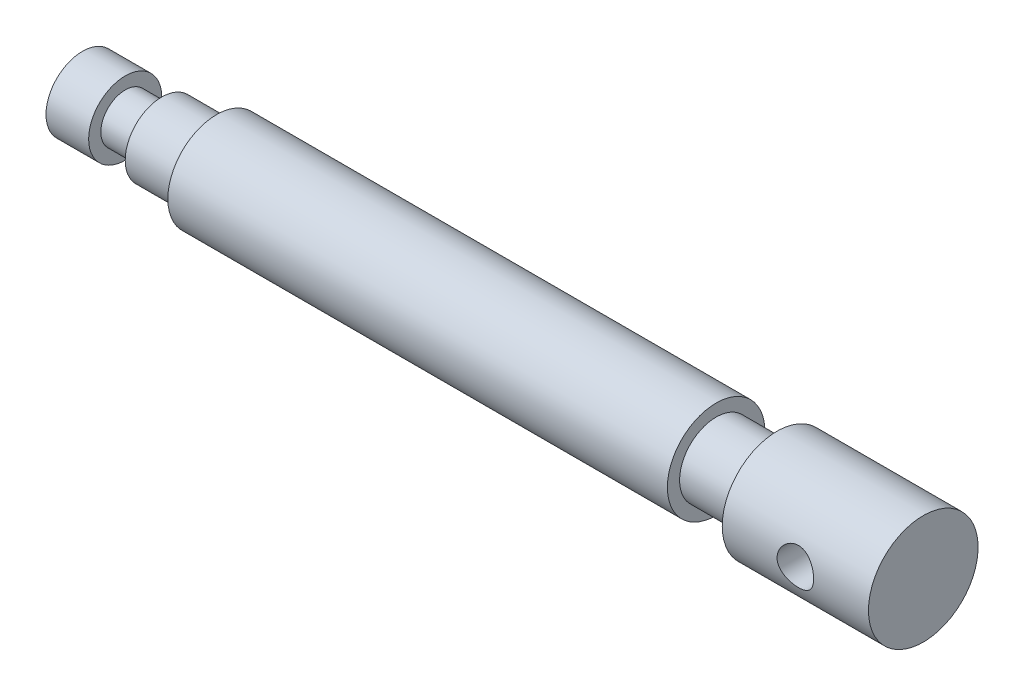
ISO-10303-21;
HEADER;
FILE_DESCRIPTION(('STEP AP214'),'2;1');
FILE_NAME('part.step','',(''),(''),'','','');
FILE_SCHEMA(('AUTOMOTIVE_DESIGN { 1 0 10303 214 1 1 1 1 }'));
ENDSEC;
DATA;
#1=APPLICATION_CONTEXT('core data for automotive mechanical design processes');
#2=APPLICATION_PROTOCOL_DEFINITION('international standard','automotive_design',2000,#1);
#3=PRODUCT_CONTEXT('',#1,'mechanical');
#4=PRODUCT('Part','Part','',(#3));
#5=PRODUCT_RELATED_PRODUCT_CATEGORY('part','',(#4));
#6=PRODUCT_DEFINITION_FORMATION('','',#4);
#7=PRODUCT_DEFINITION_CONTEXT('part definition',#1,'design');
#8=PRODUCT_DEFINITION('design','',#6,#7);
#9=PRODUCT_DEFINITION_SHAPE('','',#8);
#10=(LENGTH_UNIT() NAMED_UNIT(*) SI_UNIT(.MILLI.,.METRE.));
#11=(NAMED_UNIT(*) PLANE_ANGLE_UNIT() SI_UNIT($,.RADIAN.));
#12=(NAMED_UNIT(*) SI_UNIT($,.STERADIAN.) SOLID_ANGLE_UNIT());
#13=UNCERTAINTY_MEASURE_WITH_UNIT(LENGTH_MEASURE(1.E-05),#10,'distance_accuracy_value','');
#14=(GEOMETRIC_REPRESENTATION_CONTEXT(3) GLOBAL_UNCERTAINTY_ASSIGNED_CONTEXT((#13)) GLOBAL_UNIT_ASSIGNED_CONTEXT((#10,
#11,#12)) REPRESENTATION_CONTEXT('',''));
#15=CARTESIAN_POINT('',(0.,0.,0.));
#16=DIRECTION('',(0.,0.,1.));
#17=DIRECTION('',(1.,0.,0.));
#18=AXIS2_PLACEMENT_3D('',#15,#16,#17);
#19=CARTESIAN_POINT('',(0.,0.,0.));
#20=DIRECTION('',(1.,0.,0.));
#21=DIRECTION('',(0.,0.,-1.));
#22=AXIS2_PLACEMENT_3D('',#19,#20,#21);
#23=PLANE('',#22);
#24=CARTESIAN_POINT('',(0.,0.,0.));
#25=DIRECTION('',(-1.,0.,0.));
#26=DIRECTION('',(0.,0.,1.));
#27=AXIS2_PLACEMENT_3D('',#24,#25,#26);
#28=CIRCLE('',#27,6.);
#29=CARTESIAN_POINT('',(0.,0.,6.));
#30=VERTEX_POINT('',#29);
#31=EDGE_CURVE('E10',#30,#30,#28,.T.);
#32=ORIENTED_EDGE('',*,*,#31,.T.);
#33=EDGE_LOOP('',(#32));
#34=FACE_BOUND('',#33,.T.);
#35=ADVANCED_FACE('F37',(#34),#23,.F.);
#36=CARTESIAN_POINT('',(0.,0.,0.));
#37=DIRECTION('',(-1.,0.,0.));
#38=DIRECTION('',(0.,0.,1.));
#39=AXIS2_PLACEMENT_3D('',#36,#37,#38);
#40=CYLINDRICAL_SURFACE('',#39,6.);
#41=ORIENTED_EDGE('',*,*,#31,.F.);
#42=EDGE_LOOP('',(#41));
#43=FACE_BOUND('',#42,.T.);
#44=CARTESIAN_POINT('',(7.,0.,0.));
#45=DIRECTION('',(-1.,0.,0.));
#46=DIRECTION('',(0.,0.,1.));
#47=AXIS2_PLACEMENT_3D('',#44,#45,#46);
#48=CIRCLE('',#47,6.);
#49=CARTESIAN_POINT('',(7.,0.,6.));
#50=VERTEX_POINT('',#49);
#51=EDGE_CURVE('E50',#50,#50,#48,.T.);
#52=ORIENTED_EDGE('',*,*,#51,.T.);
#53=EDGE_LOOP('',(#52));
#54=FACE_BOUND('',#53,.T.);
#55=ADVANCED_FACE('F84',(#43,#54),#40,.T.);
#56=CARTESIAN_POINT('',(7.,6.,0.));
#57=DIRECTION('',(-1.,0.,0.));
#58=DIRECTION('',(0.,0.,1.));
#59=AXIS2_PLACEMENT_3D('',#56,#57,#58);
#60=PLANE('',#59);
#61=ORIENTED_EDGE('',*,*,#51,.F.);
#62=EDGE_LOOP('',(#61));
#63=FACE_BOUND('',#62,.T.);
#64=CARTESIAN_POINT('',(7.,0.,0.));
#65=DIRECTION('',(-1.,0.,0.));
#66=DIRECTION('',(0.,0.,1.));
#67=AXIS2_PLACEMENT_3D('',#64,#65,#66);
#68=CIRCLE('',#67,4.);
#69=CARTESIAN_POINT('',(7.,0.,4.));
#70=VERTEX_POINT('',#69);
#71=EDGE_CURVE('E56',#70,#70,#68,.T.);
#72=ORIENTED_EDGE('',*,*,#71,.T.);
#73=EDGE_LOOP('',(#72));
#74=FACE_BOUND('',#73,.T.);
#75=ADVANCED_FACE('F88',(#63,#74),#60,.F.);
#76=CARTESIAN_POINT('',(0.,0.,0.));
#77=DIRECTION('',(-1.,0.,0.));
#78=DIRECTION('',(0.,0.,1.));
#79=AXIS2_PLACEMENT_3D('',#76,#77,#78);
#80=CYLINDRICAL_SURFACE('',#79,4.);
#81=ORIENTED_EDGE('',*,*,#71,.F.);
#82=EDGE_LOOP('',(#81));
#83=FACE_BOUND('',#82,.T.);
#84=CARTESIAN_POINT('',(13.,0.,0.));
#85=DIRECTION('',(-1.,0.,0.));
#86=DIRECTION('',(0.,0.,1.));
#87=AXIS2_PLACEMENT_3D('',#84,#85,#86);
#88=CIRCLE('',#87,4.);
#89=CARTESIAN_POINT('',(13.,0.,4.));
#90=VERTEX_POINT('',#89);
#91=EDGE_CURVE('E165',#90,#90,#88,.T.);
#92=ORIENTED_EDGE('',*,*,#91,.T.);
#93=EDGE_LOOP('',(#92));
#94=FACE_BOUND('',#93,.T.);
#95=ADVANCED_FACE('F93',(#83,#94),#80,.T.);
#96=CARTESIAN_POINT('',(13.,4.,0.));
#97=DIRECTION('',(1.,0.,0.));
#98=DIRECTION('',(0.,0.,-1.));
#99=AXIS2_PLACEMENT_3D('',#96,#97,#98);
#100=PLANE('',#99);
#101=ORIENTED_EDGE('',*,*,#91,.F.);
#102=EDGE_LOOP('',(#101));
#103=FACE_BOUND('',#102,.T.);
#104=CARTESIAN_POINT('',(13.,0.,0.));
#105=DIRECTION('',(-1.,0.,0.));
#106=DIRECTION('',(0.,0.,1.));
#107=AXIS2_PLACEMENT_3D('',#104,#105,#106);
#108=CIRCLE('',#107,6.);
#109=CARTESIAN_POINT('',(13.,0.,6.));
#110=VERTEX_POINT('',#109);
#111=EDGE_CURVE('E161',#110,#110,#108,.T.);
#112=ORIENTED_EDGE('',*,*,#111,.T.);
#113=EDGE_LOOP('',(#112));
#114=FACE_BOUND('',#113,.T.);
#115=ADVANCED_FACE('F100',(#103,#114),#100,.F.);
#116=CARTESIAN_POINT('',(0.,0.,0.));
#117=DIRECTION('',(-1.,0.,0.));
#118=DIRECTION('',(0.,0.,1.));
#119=AXIS2_PLACEMENT_3D('',#116,#117,#118);
#120=CYLINDRICAL_SURFACE('',#119,6.);
#121=ORIENTED_EDGE('',*,*,#111,.F.);
#122=EDGE_LOOP('',(#121));
#123=FACE_BOUND('',#122,.T.);
#124=CARTESIAN_POINT('',(22.,0.,0.));
#125=DIRECTION('',(-1.,0.,0.));
#126=DIRECTION('',(0.,0.,1.));
#127=AXIS2_PLACEMENT_3D('',#124,#125,#126);
#128=CIRCLE('',#127,6.);
#129=CARTESIAN_POINT('',(22.,0.,6.));
#130=VERTEX_POINT('',#129);
#131=EDGE_CURVE('E157',#130,#130,#128,.T.);
#132=ORIENTED_EDGE('',*,*,#131,.T.);
#133=EDGE_LOOP('',(#132));
#134=FACE_BOUND('',#133,.T.);
#135=ADVANCED_FACE('F104',(#123,#134),#120,.T.);
#136=CARTESIAN_POINT('',(22.,6.,0.));
#137=DIRECTION('',(1.,0.,0.));
#138=DIRECTION('',(0.,0.,-1.));
#139=AXIS2_PLACEMENT_3D('',#136,#137,#138);
#140=PLANE('',#139);
#141=ORIENTED_EDGE('',*,*,#131,.F.);
#142=EDGE_LOOP('',(#141));
#143=FACE_BOUND('',#142,.T.);
#144=CARTESIAN_POINT('',(22.,0.,0.));
#145=DIRECTION('',(-1.,0.,0.));
#146=DIRECTION('',(0.,0.,1.));
#147=AXIS2_PLACEMENT_3D('',#144,#145,#146);
#148=CIRCLE('',#147,8.);
#149=CARTESIAN_POINT('',(22.,0.,8.));
#150=VERTEX_POINT('',#149);
#151=EDGE_CURVE('E153',#150,#150,#148,.T.);
#152=ORIENTED_EDGE('',*,*,#151,.T.);
#153=EDGE_LOOP('',(#152));
#154=FACE_BOUND('',#153,.T.);
#155=ADVANCED_FACE('F108',(#143,#154),#140,.F.);
#156=CARTESIAN_POINT('',(0.,0.,0.));
#157=DIRECTION('',(-1.,0.,0.));
#158=DIRECTION('',(0.,0.,1.));
#159=AXIS2_PLACEMENT_3D('',#156,#157,#158);
#160=CYLINDRICAL_SURFACE('',#159,8.);
#161=ORIENTED_EDGE('',*,*,#151,.F.);
#162=EDGE_LOOP('',(#161));
#163=FACE_BOUND('',#162,.T.);
#164=CARTESIAN_POINT('',(104.,0.,0.));
#165=DIRECTION('',(-1.,0.,0.));
#166=DIRECTION('',(0.,0.,1.));
#167=AXIS2_PLACEMENT_3D('',#164,#165,#166);
#168=CIRCLE('',#167,8.);
#169=CARTESIAN_POINT('',(104.,0.,8.));
#170=VERTEX_POINT('',#169);
#171=EDGE_CURVE('E149',#170,#170,#168,.T.);
#172=ORIENTED_EDGE('',*,*,#171,.T.);
#173=EDGE_LOOP('',(#172));
#174=FACE_BOUND('',#173,.T.);
#175=ADVANCED_FACE('F112',(#163,#174),#160,.T.);
#176=CARTESIAN_POINT('',(104.,8.,0.));
#177=DIRECTION('',(-1.,0.,0.));
#178=DIRECTION('',(0.,0.,1.));
#179=AXIS2_PLACEMENT_3D('',#176,#177,#178);
#180=PLANE('',#179);
#181=ORIENTED_EDGE('',*,*,#171,.F.);
#182=EDGE_LOOP('',(#181));
#183=FACE_BOUND('',#182,.T.);
#184=CARTESIAN_POINT('',(104.,0.,0.));
#185=DIRECTION('',(-1.,0.,0.));
#186=DIRECTION('',(0.,0.,1.));
#187=AXIS2_PLACEMENT_3D('',#184,#185,#186);
#188=CIRCLE('',#187,6.);
#189=CARTESIAN_POINT('',(104.,0.,6.));
#190=VERTEX_POINT('',#189);
#191=EDGE_CURVE('E141',#190,#190,#188,.T.);
#192=ORIENTED_EDGE('',*,*,#191,.T.);
#193=EDGE_LOOP('',(#192));
#194=FACE_BOUND('',#193,.T.);
#195=ADVANCED_FACE('F116',(#183,#194),#180,.F.);
#196=CARTESIAN_POINT('',(0.,0.,0.));
#197=DIRECTION('',(-1.,0.,0.));
#198=DIRECTION('',(0.,0.,1.));
#199=AXIS2_PLACEMENT_3D('',#196,#197,#198);
#200=CYLINDRICAL_SURFACE('',#199,6.);
#201=ORIENTED_EDGE('',*,*,#191,.F.);
#202=EDGE_LOOP('',(#201));
#203=FACE_BOUND('',#202,.T.);
#204=CARTESIAN_POINT('',(114.,0.,0.));
#205=DIRECTION('',(-1.,0.,0.));
#206=DIRECTION('',(0.,0.,1.));
#207=AXIS2_PLACEMENT_3D('',#204,#205,#206);
#208=CIRCLE('',#207,6.);
#209=CARTESIAN_POINT('',(114.,0.,6.));
#210=VERTEX_POINT('',#209);
#211=EDGE_CURVE('E131',#210,#210,#208,.T.);
#212=ORIENTED_EDGE('',*,*,#211,.T.);
#213=EDGE_LOOP('',(#212));
#214=FACE_BOUND('',#213,.T.);
#215=ADVANCED_FACE('F120',(#203,#214),#200,.T.);
#216=CARTESIAN_POINT('',(114.,6.,0.));
#217=DIRECTION('',(1.,0.,0.));
#218=DIRECTION('',(0.,0.,-1.));
#219=AXIS2_PLACEMENT_3D('',#216,#217,#218);
#220=PLANE('',#219);
#221=ORIENTED_EDGE('',*,*,#211,.F.);
#222=EDGE_LOOP('',(#221));
#223=FACE_BOUND('',#222,.T.);
#224=CARTESIAN_POINT('',(114.,0.,0.));
#225=DIRECTION('',(-1.,0.,0.));
#226=DIRECTION('',(0.,0.,1.));
#227=AXIS2_PLACEMENT_3D('',#224,#225,#226);
#228=CIRCLE('',#227,9.);
#229=CARTESIAN_POINT('',(114.,0.,9.));
#230=VERTEX_POINT('',#229);
#231=EDGE_CURVE('E134',#230,#230,#228,.T.);
#232=ORIENTED_EDGE('',*,*,#231,.T.);
#233=EDGE_LOOP('',(#232));
#234=FACE_BOUND('',#233,.T.);
#235=ADVANCED_FACE('F80',(#223,#234),#220,.F.);
#236=CARTESIAN_POINT('',(0.,0.,0.));
#237=DIRECTION('',(-1.,0.,0.));
#238=DIRECTION('',(0.,0.,1.));
#239=AXIS2_PLACEMENT_3D('',#236,#237,#238);
#240=CYLINDRICAL_SURFACE('',#239,9.);
#241=CARTESIAN_POINT('',(129.,0.,9.));
#242=CARTESIAN_POINT('',(129.000000761195,-0.163690088660168,9.00000045902832));
#243=CARTESIAN_POINT('',(128.986559201618,-0.327375583615646,8.99549308522634));
#244=CARTESIAN_POINT('',(128.933312673548,-0.649925282618915,8.97795630609842));
#245=CARTESIAN_POINT('',(128.893504968153,-0.808788984356455,8.96492601606458));
#246=CARTESIAN_POINT('',(128.789042269848,-1.11699836850533,8.93175923719328));
#247=CARTESIAN_POINT('',(128.724428812622,-1.26635947765811,8.9116346319256));
#248=CARTESIAN_POINT('',(128.572376481485,-1.55212481041598,8.86633337152025));
#249=CARTESIAN_POINT('',(128.484933104992,-1.68852647087612,8.84115572003334));
#250=CARTESIAN_POINT('',(128.286522585424,-1.94922502506681,8.78742283329015));
#251=CARTESIAN_POINT('',(128.174906297218,-2.07301110089494,8.75878669391354));
#252=CARTESIAN_POINT('',(127.93269853588,-2.30049807810627,8.70180944349364));
#253=CARTESIAN_POINT('',(127.802102895214,-2.4041945564684,8.67346839871647));
#254=CARTESIAN_POINT('',(127.521044654411,-2.59147482668358,8.61939997431821));
#255=CARTESIAN_POINT('',(127.370118780804,-2.6743945746631,8.59377117827064));
#256=CARTESIAN_POINT('',(127.055471716624,-2.81345662163316,8.54925916255803));
#257=CARTESIAN_POINT('',(126.891754448512,-2.86960709216029,8.53037388482237));
#258=CARTESIAN_POINT('',(126.56198033551,-2.95162038452749,8.50233909808132));
#259=CARTESIAN_POINT('',(126.396188374533,-2.97844034481531,8.49288287308834));
#260=CARTESIAN_POINT('',(126.062208737532,-3.00402337000343,8.48386969888523));
#261=CARTESIAN_POINT('',(125.894021817872,-3.00279510481415,8.4843096906819));
#262=CARTESIAN_POINT('',(125.568190108668,-2.97305971111025,8.49477045024541));
#263=CARTESIAN_POINT('',(125.410414791243,-2.94580173950098,8.50435247602599));
#264=CARTESIAN_POINT('',(125.101819741179,-2.86681848854824,8.53129973173653));
#265=CARTESIAN_POINT('',(124.951000843695,-2.8150902797756,8.54866589352323));
#266=CARTESIAN_POINT('',(124.657761751226,-2.68781717418062,8.58953733393746));
#267=CARTESIAN_POINT('',(124.515515923591,-2.61190214612178,8.61313697379352));
#268=CARTESIAN_POINT('',(124.245387275161,-2.43866731890941,8.66377675727179));
#269=CARTESIAN_POINT('',(124.1175086192,-2.34134133709201,8.69081789371391));
#270=CARTESIAN_POINT('',(123.872725205518,-2.1220479980467,8.74701987503223));
#271=CARTESIAN_POINT('',(123.756741916473,-1.99905945022893,8.77621768064529));
#272=CARTESIAN_POINT('',(123.54680620001,-1.73501870991019,8.8322081516111));
#273=CARTESIAN_POINT('',(123.452855885507,-1.59396478698244,8.85900058614202));
#274=CARTESIAN_POINT('',(123.288911099295,-1.2958428391388,8.90751323813381));
#275=CARTESIAN_POINT('',(123.219163525978,-1.13862982924901,8.92918050024118));
#276=CARTESIAN_POINT('',(123.107390478133,-0.813807250093518,8.96461701433304));
#277=CARTESIAN_POINT('',(123.06535537373,-0.646201314464856,8.97838900964638));
#278=CARTESIAN_POINT('',(123.011833001933,-0.313151488587907,8.99602881214321));
#279=CARTESIAN_POINT('',(122.999100572482,-0.147928799594535,9.00030005501184));
#280=CARTESIAN_POINT('',(123.000998020795,0.182325209880715,8.99966708084482));
#281=CARTESIAN_POINT('',(123.01562327994,0.347356557958954,8.99476441258087));
#282=CARTESIAN_POINT('',(123.070835723208,0.66755959891277,8.97660074151313));
#283=CARTESIAN_POINT('',(123.110658618148,0.822878420504533,8.96358596133577));
#284=CARTESIAN_POINT('',(123.2141803334,1.12456787573872,8.9307554049021));
#285=CARTESIAN_POINT('',(123.277882198403,1.27093736552582,8.91093876140025));
#286=CARTESIAN_POINT('',(123.429211295522,1.55486488917982,8.86586793861869));
#287=CARTESIAN_POINT('',(123.51742377985,1.69208987765145,8.84048444267358));
#288=CARTESIAN_POINT('',(123.71458245004,1.95019449040677,8.78715761748787));
#289=CARTESIAN_POINT('',(123.823534968095,2.07106910338673,8.75921350781483));
#290=CARTESIAN_POINT('',(124.06493625302,2.2987575234189,8.70230543941334));
#291=CARTESIAN_POINT('',(124.198227680781,2.40468290773732,8.67335283262283));
#292=CARTESIAN_POINT('',(124.481314703433,2.59277256697073,8.61899919884126));
#293=CARTESIAN_POINT('',(124.631110435902,2.67493664379304,8.59359820146007));
#294=CARTESIAN_POINT('',(124.94301904587,2.81279079124908,8.54947175374151));
#295=CARTESIAN_POINT('',(125.105106237506,2.86853439649506,8.53073282378937));
#296=CARTESIAN_POINT('',(125.437135950132,2.95168400027806,8.50232496919349));
#297=CARTESIAN_POINT('',(125.607074896213,2.97910276486182,8.49265195870918));
#298=CARTESIAN_POINT('',(125.940591288123,3.00382884743202,8.48393576622532));
#299=CARTESIAN_POINT('',(126.10404702086,3.00261077192519,8.48437200772246));
#300=CARTESIAN_POINT('',(126.428295224766,2.97372688034607,8.49453809471602));
#301=CARTESIAN_POINT('',(126.589087853865,2.94606263837575,8.50426738708085));
#302=CARTESIAN_POINT('',(126.900406989007,2.86611543938802,8.53153572914676));
#303=CARTESIAN_POINT('',(127.051070475014,2.81431003804652,8.54892294067433));
#304=CARTESIAN_POINT('',(127.341682220815,2.68793809727922,8.58949196455406));
#305=CARTESIAN_POINT('',(127.481628093564,2.6133665056614,8.6126750629018));
#306=CARTESIAN_POINT('',(127.753451009769,2.43978207775028,8.66348487678139));
#307=CARTESIAN_POINT('',(127.884709505695,2.33984472829373,8.69126134926411));
#308=CARTESIAN_POINT('',(128.129069440153,2.11992864940694,8.74750068849759));
#309=CARTESIAN_POINT('',(128.242165727064,1.99994425335444,8.77596374737117));
#310=CARTESIAN_POINT('',(128.451433236868,1.73772467076206,8.83170091576632));
#311=CARTESIAN_POINT('',(128.546773043253,1.59480454049918,8.8588854540377));
#312=CARTESIAN_POINT('',(128.711971286552,1.29407207221986,8.90777973517836));
#313=CARTESIAN_POINT('',(128.781836237766,1.13626355439703,8.9294908772379));
#314=CARTESIAN_POINT('',(128.891164897466,0.817480941602908,8.96416545205626));
#315=CARTESIAN_POINT('',(128.93184739879,0.656963273029206,8.97747637267568));
#316=CARTESIAN_POINT('',(128.986260842031,0.330961248030728,8.99539221192665));
#317=CARTESIAN_POINT('',(128.99999923049,0.165478276706233,8.99999953595715));
#318=CARTESIAN_POINT('',(129.,0.,9.));
#319=B_SPLINE_CURVE_WITH_KNOTS('',3,(#241,#242,#243,#244,#245,#246,#247,#248,#249,#250,#251,
#252,#253,#254,#255,#256,#257,#258,#259,#260,#261,#262,#263,#264,#265,#266,#267,#268,#269,#270,
#271,#272,#273,#274,#275,#276,#277,#278,#279,#280,#281,#282,#283,#284,#285,#286,#287,#288,#289,
#290,#291,#292,#293,#294,#295,#296,#297,#298,#299,#300,#301,#302,#303,#304,#305,#306,#307,#308,
#309,#310,#311,#312,#313,#314,#315,#316,#317,#318),.UNSPECIFIED.,.T.,.F.,(4,2,2,2,2,2,2,2,2,2,2,
2,2,2,2,2,2,2,2,2,2,2,2,2,2,2,2,2,2,2,2,2,2,2,2,2,2,2,4),(0.,0.490461318078031,
0.980973555802568,1.47066801861083,1.96045913339732,2.46554052848272,2.97073299862593,
3.49045154470414,4.01001134078502,4.51205777225523,5.01394901962457,5.49290479653844,
5.97191792566447,6.45864513465392,6.94551307674621,7.457799174341,7.97013437899854,
8.48755216951071,9.00479006631624,9.49960749525507,9.99434139492528,10.4747447393464,
10.9552093585231,11.4483119953121,11.9415654246567,12.4572306864225,12.9729002470499,
13.4875204148031,14.0019085411752,14.4898699819277,14.9778023805413,15.4564676124125,
15.9352391452793,16.4349020007541,16.9347063337133,17.453989825053,17.9731404345737,
18.4690967512144,18.9649159811442),.UNSPECIFIED.);
#320=CARTESIAN_POINT('',(129.,0.,9.));
#321=VERTEX_POINT('',#320);
#322=EDGE_CURVE('E40',#321,#321,#319,.T.);
#323=ORIENTED_EDGE('',*,*,#322,.T.);
#324=EDGE_LOOP('',(#323));
#325=FACE_BOUND('',#324,.T.);
#326=CARTESIAN_POINT('',(129.,0.,-9.));
#327=CARTESIAN_POINT('',(129.000000761195,0.16369008866017,-9.00000045902832));
#328=CARTESIAN_POINT('',(128.986559201618,0.327375583615649,-8.99549308522634));
#329=CARTESIAN_POINT('',(128.933312673548,0.649925282618917,-8.97795630609842));
#330=CARTESIAN_POINT('',(128.893504968153,0.808788984356453,-8.96492601606458));
#331=CARTESIAN_POINT('',(128.789042269848,1.11699836850533,-8.93175923719328));
#332=CARTESIAN_POINT('',(128.724428812622,1.2663594776581,-8.9116346319256));
#333=CARTESIAN_POINT('',(128.572376481485,1.55212481041598,-8.86633337152025));
#334=CARTESIAN_POINT('',(128.484933104992,1.68852647087612,-8.84115572003334));
#335=CARTESIAN_POINT('',(128.286522585424,1.9492250250668,-8.78742283329015));
#336=CARTESIAN_POINT('',(128.174906297219,2.07301110089493,-8.75878669391354));
#337=CARTESIAN_POINT('',(127.93269853588,2.30049807810625,-8.70180944349364));
#338=CARTESIAN_POINT('',(127.802102895214,2.40419455646839,-8.67346839871647));
#339=CARTESIAN_POINT('',(127.521044654411,2.59147482668358,-8.61939997431821));
#340=CARTESIAN_POINT('',(127.370118780804,2.6743945746631,-8.59377117827064));
#341=CARTESIAN_POINT('',(127.055471716624,2.81345662163316,-8.54925916255803));
#342=CARTESIAN_POINT('',(126.891754448512,2.86960709216029,-8.53037388482237));
#343=CARTESIAN_POINT('',(126.56198033551,2.95162038452748,-8.50233909808132));
#344=CARTESIAN_POINT('',(126.396188374533,2.9784403448153,-8.49288287308834));
#345=CARTESIAN_POINT('',(126.062208737532,3.00402337000343,-8.48386969888523));
#346=CARTESIAN_POINT('',(125.894021817872,3.00279510481415,-8.4843096906819));
#347=CARTESIAN_POINT('',(125.568190108668,2.97305971111025,-8.49477045024541));
#348=CARTESIAN_POINT('',(125.410414791243,2.94580173950098,-8.50435247602599));
#349=CARTESIAN_POINT('',(125.101819741179,2.86681848854824,-8.53129973173653));
#350=CARTESIAN_POINT('',(124.951000843695,2.8150902797756,-8.54866589352323));
#351=CARTESIAN_POINT('',(124.657761751226,2.68781717418062,-8.58953733393747));
#352=CARTESIAN_POINT('',(124.515515923591,2.61190214612178,-8.61313697379352));
#353=CARTESIAN_POINT('',(124.245387275161,2.43866731890941,-8.66377675727179));
#354=CARTESIAN_POINT('',(124.1175086192,2.34134133709201,-8.69081789371391));
#355=CARTESIAN_POINT('',(123.872725205518,2.1220479980467,-8.74701987503223));
#356=CARTESIAN_POINT('',(123.756741916473,1.99905945022893,-8.77621768064529));
#357=CARTESIAN_POINT('',(123.54680620001,1.73501870991019,-8.8322081516111));
#358=CARTESIAN_POINT('',(123.452855885507,1.59396478698244,-8.85900058614202));
#359=CARTESIAN_POINT('',(123.288911099295,1.2958428391388,-8.90751323813381));
#360=CARTESIAN_POINT('',(123.219163525978,1.138629829249,-8.92918050024118));
#361=CARTESIAN_POINT('',(123.107390478133,0.813807250093516,-8.96461701433304));
#362=CARTESIAN_POINT('',(123.06535537373,0.646201314464853,-8.97838900964638));
#363=CARTESIAN_POINT('',(123.011833001933,0.313151488587904,-8.99602881214321));
#364=CARTESIAN_POINT('',(122.999100572482,0.147928799594531,-9.00030005501184));
#365=CARTESIAN_POINT('',(123.000998020795,-0.182325209880718,-8.99966708084482));
#366=CARTESIAN_POINT('',(123.01562327994,-0.347356557958956,-8.99476441258087));
#367=CARTESIAN_POINT('',(123.070835723208,-0.667559598912771,-8.97660074151313));
#368=CARTESIAN_POINT('',(123.110658618148,-0.822878420504534,-8.96358596133577));
#369=CARTESIAN_POINT('',(123.2141803334,-1.12456787573872,-8.9307554049021));
#370=CARTESIAN_POINT('',(123.277882198403,-1.27093736552582,-8.91093876140025));
#371=CARTESIAN_POINT('',(123.429211295522,-1.55486488917982,-8.86586793861869));
#372=CARTESIAN_POINT('',(123.51742377985,-1.69208987765145,-8.84048444267358));
#373=CARTESIAN_POINT('',(123.71458245004,-1.95019449040676,-8.78715761748787));
#374=CARTESIAN_POINT('',(123.823534968095,-2.07106910338673,-8.75921350781483));
#375=CARTESIAN_POINT('',(124.06493625302,-2.29875752341889,-8.70230543941334));
#376=CARTESIAN_POINT('',(124.198227680781,-2.40468290773731,-8.67335283262284));
#377=CARTESIAN_POINT('',(124.481314703433,-2.59277256697072,-8.61899919884126));
#378=CARTESIAN_POINT('',(124.631110435902,-2.67493664379303,-8.59359820146007));
#379=CARTESIAN_POINT('',(124.94301904587,-2.81279079124908,-8.54947175374151));
#380=CARTESIAN_POINT('',(125.105106237506,-2.86853439649506,-8.53073282378936));
#381=CARTESIAN_POINT('',(125.437135950132,-2.95168400027806,-8.50232496919348));
#382=CARTESIAN_POINT('',(125.607074896213,-2.97910276486182,-8.49265195870918));
#383=CARTESIAN_POINT('',(125.940591288123,-3.00382884743202,-8.48393576622532));
#384=CARTESIAN_POINT('',(126.10404702086,-3.00261077192519,-8.48437200772246));
#385=CARTESIAN_POINT('',(126.428295224766,-2.97372688034607,-8.49453809471602));
#386=CARTESIAN_POINT('',(126.589087853865,-2.94606263837575,-8.50426738708085));
#387=CARTESIAN_POINT('',(126.900406989007,-2.86611543938802,-8.53153572914675));
#388=CARTESIAN_POINT('',(127.051070475014,-2.81431003804652,-8.54892294067433));
#389=CARTESIAN_POINT('',(127.341682220815,-2.68793809727922,-8.58949196455406));
#390=CARTESIAN_POINT('',(127.481628093564,-2.6133665056614,-8.6126750629018));
#391=CARTESIAN_POINT('',(127.753451009769,-2.43978207775028,-8.66348487678139));
#392=CARTESIAN_POINT('',(127.884709505695,-2.33984472829373,-8.69126134926411));
#393=CARTESIAN_POINT('',(128.129069440153,-2.11992864940694,-8.74750068849759));
#394=CARTESIAN_POINT('',(128.242165727064,-1.99994425335444,-8.77596374737117));
#395=CARTESIAN_POINT('',(128.451433236868,-1.73772467076206,-8.83170091576632));
#396=CARTESIAN_POINT('',(128.546773043253,-1.59480454049918,-8.8588854540377));
#397=CARTESIAN_POINT('',(128.711971286552,-1.29407207221986,-8.90777973517836));
#398=CARTESIAN_POINT('',(128.781836237766,-1.13626355439703,-8.9294908772379));
#399=CARTESIAN_POINT('',(128.891164897466,-0.817480941602907,-8.96416545205626));
#400=CARTESIAN_POINT('',(128.93184739879,-0.656963273029208,-8.97747637267568));
#401=CARTESIAN_POINT('',(128.986260842031,-0.330961248030731,-8.99539221192665));
#402=CARTESIAN_POINT('',(128.99999923049,-0.165478276706234,-8.99999953595715));
#403=CARTESIAN_POINT('',(129.,0.,-9.));
#404=B_SPLINE_CURVE_WITH_KNOTS('',3,(#326,#327,#328,#329,#330,#331,#332,#333,#334,#335,#336,
#337,#338,#339,#340,#341,#342,#343,#344,#345,#346,#347,#348,#349,#350,#351,#352,#353,#354,#355,
#356,#357,#358,#359,#360,#361,#362,#363,#364,#365,#366,#367,#368,#369,#370,#371,#372,#373,#374,
#375,#376,#377,#378,#379,#380,#381,#382,#383,#384,#385,#386,#387,#388,#389,#390,#391,#392,#393,
#394,#395,#396,#397,#398,#399,#400,#401,#402,#403),.UNSPECIFIED.,.T.,.F.,(4,2,2,2,2,2,2,2,2,2,2,
2,2,2,2,2,2,2,2,2,2,2,2,2,2,2,2,2,2,2,2,2,2,2,2,2,2,2,4),(0.,0.490461318078033,
0.980973555802562,1.47066801861083,1.96045913339731,2.46554052848269,2.97073299862591,
3.49045154470411,4.01001134078499,4.51205777225523,5.01394901962458,5.49290479653844,
5.97191792566448,6.45864513465392,6.94551307674621,7.457799174341,7.97013437899854,
8.48755216951072,9.00479006631624,9.49960749525508,9.99434139492528,10.4747447393464,
10.9552093585231,11.4483119953121,11.9415654246567,12.4572306864225,12.9729002470499,
13.4875204148031,14.0019085411752,14.4898699819277,14.9778023805413,15.4564676124125,
15.9352391452793,16.4349020007541,16.9347063337134,17.453989825053,17.9731404345737,
18.4690967512144,18.9649159811442),.UNSPECIFIED.);
#405=CARTESIAN_POINT('',(129.,0.,-9.));
#406=VERTEX_POINT('',#405);
#407=EDGE_CURVE('E59',#406,#406,#404,.T.);
#408=ORIENTED_EDGE('',*,*,#407,.T.);
#409=EDGE_LOOP('',(#408));
#410=FACE_BOUND('',#409,.T.);
#411=ORIENTED_EDGE('',*,*,#231,.F.);
#412=EDGE_LOOP('',(#411));
#413=FACE_BOUND('',#412,.T.);
#414=CARTESIAN_POINT('',(138.,0.,0.));
#415=DIRECTION('',(-1.,0.,0.));
#416=DIRECTION('',(0.,0.,1.));
#417=AXIS2_PLACEMENT_3D('',#414,#415,#416);
#418=CIRCLE('',#417,9.);
#419=CARTESIAN_POINT('',(138.,0.,9.));
#420=VERTEX_POINT('',#419);
#421=EDGE_CURVE('E137',#420,#420,#418,.T.);
#422=ORIENTED_EDGE('',*,*,#421,.T.);
#423=EDGE_LOOP('',(#422));
#424=FACE_BOUND('',#423,.T.);
#425=ADVANCED_FACE('F65',(#325,#410,#413,#424),#240,.T.);
#426=CARTESIAN_POINT('',(138.,9.,0.));
#427=DIRECTION('',(-1.,0.,0.));
#428=DIRECTION('',(0.,0.,1.));
#429=AXIS2_PLACEMENT_3D('',#426,#427,#428);
#430=PLANE('',#429);
#431=ORIENTED_EDGE('',*,*,#421,.F.);
#432=EDGE_LOOP('',(#431));
#433=FACE_BOUND('',#432,.T.);
#434=ADVANCED_FACE('F72',(#433),#430,.F.);
#435=CARTESIAN_POINT('',(126.,0.,-57.));
#436=DIRECTION('',(0.,0.,1.));
#437=DIRECTION('',(1.,0.,0.));
#438=AXIS2_PLACEMENT_3D('',#435,#436,#437);
#439=CYLINDRICAL_SURFACE('',#438,2.99999999999999);
#440=ORIENTED_EDGE('',*,*,#407,.F.);
#441=EDGE_LOOP('',(#440));
#442=FACE_BOUND('',#441,.T.);
#443=ORIENTED_EDGE('',*,*,#322,.F.);
#444=EDGE_LOOP('',(#443));
#445=FACE_BOUND('',#444,.T.);
#446=ADVANCED_FACE('F69',(#442,#445),#439,.F.);
#447=CLOSED_SHELL('',(#35,#55,#75,#95,#115,#135,#155,#175,#195,#215,#235,#425,#434,#446));
#448=MANIFOLD_SOLID_BREP('B2',#447);
#449=ADVANCED_BREP_SHAPE_REPRESENTATION('',(#18,#448),#14);
#450=SHAPE_DEFINITION_REPRESENTATION(#9,#449);
ENDSEC;
END-ISO-10303-21;
